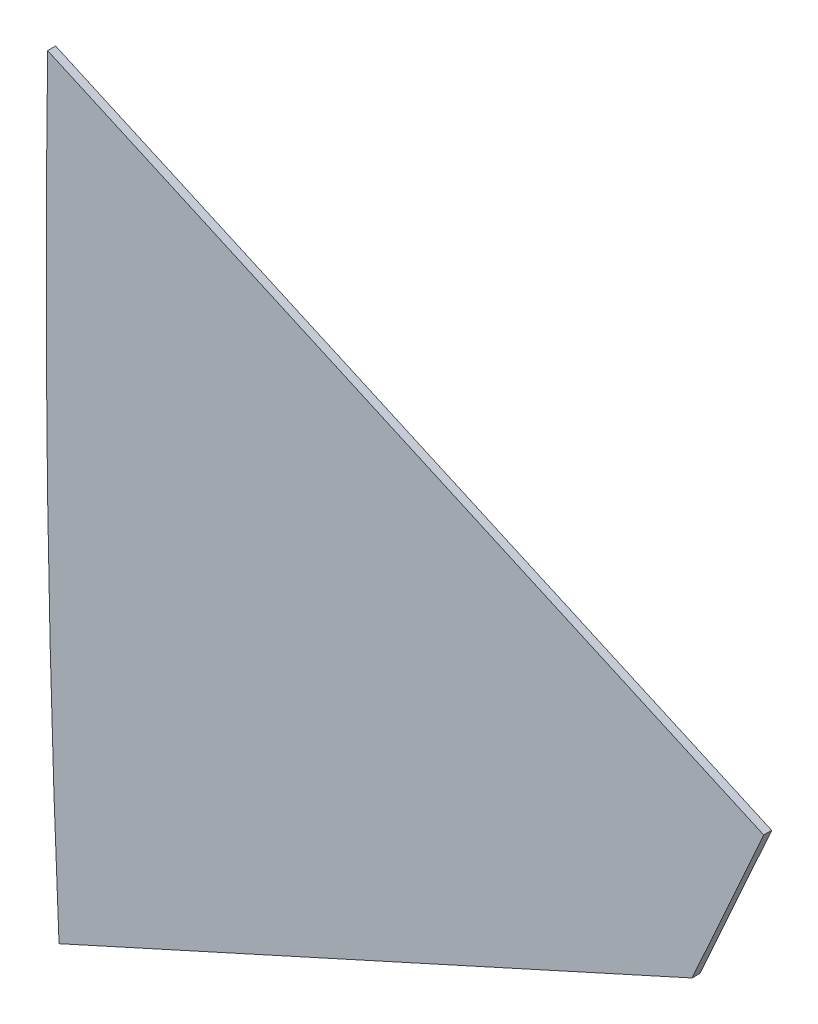
ISO-10303-21;
HEADER;
FILE_DESCRIPTION(('STEP AP214'),'2;1');
FILE_NAME('part.step','',(''),(''),'','','');
FILE_SCHEMA(('AUTOMOTIVE_DESIGN { 1 0 10303 214 1 1 1 1 }'));
ENDSEC;
DATA;
#1=APPLICATION_CONTEXT('core data for automotive mechanical design processes');
#2=APPLICATION_PROTOCOL_DEFINITION('international standard','automotive_design',2000,#1);
#3=PRODUCT_CONTEXT('',#1,'mechanical');
#4=PRODUCT('Part','Part','',(#3));
#5=PRODUCT_RELATED_PRODUCT_CATEGORY('part','',(#4));
#6=PRODUCT_DEFINITION_FORMATION('','',#4);
#7=PRODUCT_DEFINITION_CONTEXT('part definition',#1,'design');
#8=PRODUCT_DEFINITION('design','',#6,#7);
#9=PRODUCT_DEFINITION_SHAPE('','',#8);
#10=(LENGTH_UNIT() NAMED_UNIT(*) SI_UNIT(.MILLI.,.METRE.));
#11=(NAMED_UNIT(*) PLANE_ANGLE_UNIT() SI_UNIT($,.RADIAN.));
#12=(NAMED_UNIT(*) SI_UNIT($,.STERADIAN.) SOLID_ANGLE_UNIT());
#13=UNCERTAINTY_MEASURE_WITH_UNIT(LENGTH_MEASURE(1.E-05),#10,'distance_accuracy_value','');
#14=(GEOMETRIC_REPRESENTATION_CONTEXT(3) GLOBAL_UNCERTAINTY_ASSIGNED_CONTEXT((#13)) GLOBAL_UNIT_ASSIGNED_CONTEXT((#10,
#11,#12)) REPRESENTATION_CONTEXT('',''));
#15=CARTESIAN_POINT('',(0.,0.,0.));
#16=DIRECTION('',(0.,0.,1.));
#17=DIRECTION('',(1.,0.,0.));
#18=AXIS2_PLACEMENT_3D('',#15,#16,#17);
#19=CARTESIAN_POINT('',(7624.91427557874,43.7393486660075,-122.2248));
#20=DIRECTION('',(0.,0.,-1.));
#21=DIRECTION('',(-1.,0.,0.));
#22=AXIS2_PLACEMENT_3D('',#19,#20,#21);
#23=CYLINDRICAL_SURFACE('',#22,7620.);
#24=CARTESIAN_POINT('',(7624.91427557874,43.7393486660075,-127.));
#25=DIRECTION('',(0.,0.,1.));
#26=DIRECTION('',(1.,0.,0.));
#27=AXIS2_PLACEMENT_3D('',#24,#25,#26);
#28=CIRCLE('',#27,7620.);
#29=CARTESIAN_POINT('',(5.80709062055496,160.382840205641,-127.));
#30=VERTEX_POINT('',#29);
#31=CARTESIAN_POINT('',(12.6381588716669,-299.265495339261,-127.));
#32=VERTEX_POINT('',#31);
#33=EDGE_CURVE('E89',#30,#32,#28,.T.);
#34=ORIENTED_EDGE('',*,*,#33,.T.);
#35=DIRECTION('',(0.,0.,-1.));
#36=VECTOR('',#35,1.);
#37=CARTESIAN_POINT('',(12.6381588716669,-299.265495339261,-122.2248));
#38=LINE('',#37,#36);
#39=CARTESIAN_POINT('',(12.6381588716669,-299.265495339261,-122.2248));
#40=VERTEX_POINT('',#39);
#41=EDGE_CURVE('E12',#40,#32,#38,.T.);
#42=ORIENTED_EDGE('',*,*,#41,.F.);
#43=CARTESIAN_POINT('',(7624.91427557874,43.7393486660075,-122.2248));
#44=DIRECTION('',(0.,0.,1.));
#45=DIRECTION('',(1.,0.,0.));
#46=AXIS2_PLACEMENT_3D('',#43,#44,#45);
#47=CIRCLE('',#46,7620.);
#48=CARTESIAN_POINT('',(5.80709062055496,160.382840205641,-122.2248));
#49=VERTEX_POINT('',#48);
#50=EDGE_CURVE('E107',#49,#40,#47,.T.);
#51=ORIENTED_EDGE('',*,*,#50,.F.);
#52=DIRECTION('',(0.,0.,-1.));
#53=VECTOR('',#52,1.);
#54=CARTESIAN_POINT('',(5.80709062055496,160.382840205641,-122.2248));
#55=LINE('',#54,#53);
#56=EDGE_CURVE('E101',#49,#30,#55,.T.);
#57=ORIENTED_EDGE('',*,*,#56,.T.);
#58=EDGE_LOOP('',(#34,#42,#51,#57));
#59=FACE_BOUND('',#58,.T.);
#60=ADVANCED_FACE('F45',(#59),#23,.T.);
#61=CARTESIAN_POINT('',(12.6381588716669,-299.265495339261,-122.2248));
#62=DIRECTION('',(-0.412681847348485,0.910875234523939,0.));
#63=DIRECTION('',(-0.910875234523939,-0.412681847348485,0.));
#64=AXIS2_PLACEMENT_3D('',#61,#62,#63);
#65=PLANE('',#64);
#66=DIRECTION('',(0.910875234523939,0.412681847348485,0.));
#67=VECTOR('',#66,1.);
#68=CARTESIAN_POINT('',(12.6381588716669,-299.265495339261,-127.));
#69=LINE('',#68,#67);
#70=CARTESIAN_POINT('',(391.657215250933,-127.546824726129,-127.));
#71=VERTEX_POINT('',#70);
#72=EDGE_CURVE('E85',#32,#71,#69,.T.);
#73=ORIENTED_EDGE('',*,*,#72,.T.);
#74=DIRECTION('',(0.,0.,-1.));
#75=VECTOR('',#74,1.);
#76=CARTESIAN_POINT('',(391.657215250933,-127.546824726129,-122.2248));
#77=LINE('',#76,#75);
#78=CARTESIAN_POINT('',(391.657215250933,-127.546824726129,-122.2248));
#79=VERTEX_POINT('',#78);
#80=EDGE_CURVE('E52',#79,#71,#77,.T.);
#81=ORIENTED_EDGE('',*,*,#80,.F.);
#82=DIRECTION('',(0.910875234523939,0.412681847348485,0.));
#83=VECTOR('',#82,1.);
#84=CARTESIAN_POINT('',(12.6381588716669,-299.265495339261,-122.2248));
#85=LINE('',#84,#83);
#86=EDGE_CURVE('E97',#40,#79,#85,.T.);
#87=ORIENTED_EDGE('',*,*,#86,.F.);
#88=ORIENTED_EDGE('',*,*,#41,.T.);
#89=EDGE_LOOP('',(#73,#81,#87,#88));
#90=FACE_BOUND('',#89,.T.);
#91=ADVANCED_FACE('F96',(#90),#65,.F.);
#92=CARTESIAN_POINT('',(391.657215250933,-127.546824726129,-122.2248));
#93=DIRECTION('',(-0.91239678749259,0.4093068557613,0.));
#94=DIRECTION('',(-0.4093068557613,-0.91239678749259,0.));
#95=AXIS2_PLACEMENT_3D('',#92,#93,#94);
#96=PLANE('',#95);
#97=DIRECTION('',(0.4093068557613,0.91239678749259,0.));
#98=VECTOR('',#97,1.);
#99=CARTESIAN_POINT('',(391.657215250933,-127.546824726129,-127.));
#100=LINE('',#99,#98);
#101=CARTESIAN_POINT('',(434.542341063323,-31.9504513165932,-127.));
#102=VERTEX_POINT('',#101);
#103=EDGE_CURVE('E90',#71,#102,#100,.T.);
#104=ORIENTED_EDGE('',*,*,#103,.T.);
#105=DIRECTION('',(0.,0.,-1.));
#106=VECTOR('',#105,1.);
#107=CARTESIAN_POINT('',(434.542341063323,-31.9504513165932,-122.2248));
#108=LINE('',#107,#106);
#109=CARTESIAN_POINT('',(434.542341063323,-31.9504513165932,-122.2248));
#110=VERTEX_POINT('',#109);
#111=EDGE_CURVE('E113',#110,#102,#108,.T.);
#112=ORIENTED_EDGE('',*,*,#111,.F.);
#113=DIRECTION('',(0.4093068557613,0.91239678749259,0.));
#114=VECTOR('',#113,1.);
#115=CARTESIAN_POINT('',(391.657215250933,-127.546824726129,-122.2248));
#116=LINE('',#115,#114);
#117=EDGE_CURVE('E64',#79,#110,#116,.T.);
#118=ORIENTED_EDGE('',*,*,#117,.F.);
#119=ORIENTED_EDGE('',*,*,#80,.T.);
#120=EDGE_LOOP('',(#104,#112,#118,#119));
#121=FACE_BOUND('',#120,.T.);
#122=ADVANCED_FACE('F116',(#121),#96,.F.);
#123=CARTESIAN_POINT('',(434.542341063323,-31.9504513165932,-122.2248));
#124=DIRECTION('',(-0.409306855761299,-0.91239678749259,0.));
#125=DIRECTION('',(0.91239678749259,-0.409306855761299,0.));
#126=AXIS2_PLACEMENT_3D('',#123,#124,#125);
#127=PLANE('',#126);
#128=DIRECTION('',(-0.91239678749259,0.409306855761299,0.));
#129=VECTOR('',#128,1.);
#130=CARTESIAN_POINT('',(434.542341063323,-31.9504513165932,-127.));
#131=LINE('',#130,#129);
#132=EDGE_CURVE('E105',#102,#30,#131,.T.);
#133=ORIENTED_EDGE('',*,*,#132,.T.);
#134=ORIENTED_EDGE('',*,*,#56,.F.);
#135=DIRECTION('',(-0.91239678749259,0.409306855761299,0.));
#136=VECTOR('',#135,1.);
#137=CARTESIAN_POINT('',(434.542341063323,-31.9504513165932,-122.2248));
#138=LINE('',#137,#136);
#139=EDGE_CURVE('E59',#110,#49,#138,.T.);
#140=ORIENTED_EDGE('',*,*,#139,.F.);
#141=ORIENTED_EDGE('',*,*,#111,.T.);
#142=EDGE_LOOP('',(#133,#134,#140,#141));
#143=FACE_BOUND('',#142,.T.);
#144=ADVANCED_FACE('F118',(#143),#127,.F.);
#145=CARTESIAN_POINT('',(7624.91427557874,43.7393486660075,-122.2248));
#146=DIRECTION('',(0.,0.,1.));
#147=DIRECTION('',(1.,0.,0.));
#148=AXIS2_PLACEMENT_3D('',#145,#146,#147);
#149=PLANE('',#148);
#150=ORIENTED_EDGE('',*,*,#50,.T.);
#151=ORIENTED_EDGE('',*,*,#86,.T.);
#152=ORIENTED_EDGE('',*,*,#117,.T.);
#153=ORIENTED_EDGE('',*,*,#139,.T.);
#154=EDGE_LOOP('',(#150,#151,#152,#153));
#155=FACE_BOUND('',#154,.T.);
#156=ADVANCED_FACE('F119',(#155),#149,.T.);
#157=CARTESIAN_POINT('',(7624.91427557874,43.7393486660075,-127.));
#158=DIRECTION('',(0.,0.,1.));
#159=DIRECTION('',(1.,0.,0.));
#160=AXIS2_PLACEMENT_3D('',#157,#158,#159);
#161=PLANE('',#160);
#162=ORIENTED_EDGE('',*,*,#33,.F.);
#163=ORIENTED_EDGE('',*,*,#132,.F.);
#164=ORIENTED_EDGE('',*,*,#103,.F.);
#165=ORIENTED_EDGE('',*,*,#72,.F.);
#166=EDGE_LOOP('',(#162,#163,#164,#165));
#167=FACE_BOUND('',#166,.T.);
#168=ADVANCED_FACE('F86',(#167),#161,.F.);
#169=CLOSED_SHELL('',(#60,#91,#122,#144,#156,#168));
#170=MANIFOLD_SOLID_BREP('B2',#169);
#171=ADVANCED_BREP_SHAPE_REPRESENTATION('',(#18,#170),#14);
#172=SHAPE_DEFINITION_REPRESENTATION(#9,#171);
ENDSEC;
END-ISO-10303-21;
